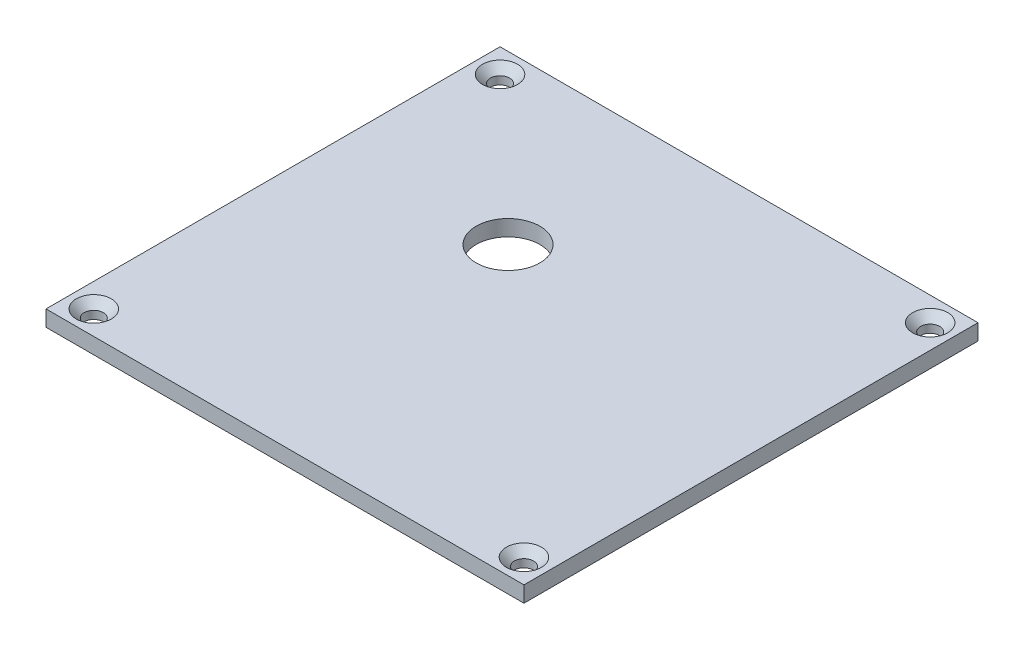
ISO-10303-21;
HEADER;
FILE_DESCRIPTION(('STEP AP214'),'2;1');
FILE_NAME('part.step','',(''),(''),'','','');
FILE_SCHEMA(('AUTOMOTIVE_DESIGN { 1 0 10303 214 1 1 1 1 }'));
ENDSEC;
DATA;
#1=APPLICATION_CONTEXT('core data for automotive mechanical design processes');
#2=APPLICATION_PROTOCOL_DEFINITION('international standard','automotive_design',2000,#1);
#3=PRODUCT_CONTEXT('',#1,'mechanical');
#4=PRODUCT('Part','Part','',(#3));
#5=PRODUCT_RELATED_PRODUCT_CATEGORY('part','',(#4));
#6=PRODUCT_DEFINITION_FORMATION('','',#4);
#7=PRODUCT_DEFINITION_CONTEXT('part definition',#1,'design');
#8=PRODUCT_DEFINITION('design','',#6,#7);
#9=PRODUCT_DEFINITION_SHAPE('','',#8);
#10=(LENGTH_UNIT() NAMED_UNIT(*) SI_UNIT(.MILLI.,.METRE.));
#11=(NAMED_UNIT(*) PLANE_ANGLE_UNIT() SI_UNIT($,.RADIAN.));
#12=(NAMED_UNIT(*) SI_UNIT($,.STERADIAN.) SOLID_ANGLE_UNIT());
#13=UNCERTAINTY_MEASURE_WITH_UNIT(LENGTH_MEASURE(1.E-05),#10,'distance_accuracy_value','');
#14=(GEOMETRIC_REPRESENTATION_CONTEXT(3) GLOBAL_UNCERTAINTY_ASSIGNED_CONTEXT((#13)) GLOBAL_UNIT_ASSIGNED_CONTEXT((#10,
#11,#12)) REPRESENTATION_CONTEXT('',''));
#15=CARTESIAN_POINT('',(0.,0.,0.));
#16=DIRECTION('',(0.,0.,1.));
#17=DIRECTION('',(1.,0.,0.));
#18=AXIS2_PLACEMENT_3D('',#15,#16,#17);
#19=CARTESIAN_POINT('',(30.,2.,28.5));
#20=DIRECTION('',(-1.,0.,0.));
#21=DIRECTION('',(0.,0.,1.));
#22=AXIS2_PLACEMENT_3D('',#19,#20,#21);
#23=PLANE('',#22);
#24=DIRECTION('',(0.,0.,-1.));
#25=VECTOR('',#24,1.);
#26=CARTESIAN_POINT('',(30.,0.,28.5));
#27=LINE('',#26,#25);
#28=CARTESIAN_POINT('',(30.,0.,28.5));
#29=VERTEX_POINT('',#28);
#30=CARTESIAN_POINT('',(30.,0.,-28.5));
#31=VERTEX_POINT('',#30);
#32=EDGE_CURVE('E99',#29,#31,#27,.T.);
#33=ORIENTED_EDGE('',*,*,#32,.T.);
#34=DIRECTION('',(0.,-1.,0.));
#35=VECTOR('',#34,1.);
#36=CARTESIAN_POINT('',(30.,2.,-28.5));
#37=LINE('',#36,#35);
#38=CARTESIAN_POINT('',(30.,2.,-28.5));
#39=VERTEX_POINT('',#38);
#40=EDGE_CURVE('E11',#39,#31,#37,.T.);
#41=ORIENTED_EDGE('',*,*,#40,.F.);
#42=DIRECTION('',(0.,0.,-1.));
#43=VECTOR('',#42,1.);
#44=CARTESIAN_POINT('',(30.,2.,28.5));
#45=LINE('',#44,#43);
#46=CARTESIAN_POINT('',(30.,2.,28.5));
#47=VERTEX_POINT('',#46);
#48=EDGE_CURVE('E87',#47,#39,#45,.T.);
#49=ORIENTED_EDGE('',*,*,#48,.F.);
#50=DIRECTION('',(0.,-1.,0.));
#51=VECTOR('',#50,1.);
#52=CARTESIAN_POINT('',(30.,2.,28.5));
#53=LINE('',#52,#51);
#54=EDGE_CURVE('E95',#47,#29,#53,.T.);
#55=ORIENTED_EDGE('',*,*,#54,.T.);
#56=EDGE_LOOP('',(#33,#41,#49,#55));
#57=FACE_BOUND('',#56,.T.);
#58=ADVANCED_FACE('F36',(#57),#23,.F.);
#59=CARTESIAN_POINT('',(-30.,2.,-28.5));
#60=DIRECTION('',(0.,0.,1.));
#61=DIRECTION('',(1.,0.,0.));
#62=AXIS2_PLACEMENT_3D('',#59,#60,#61);
#63=PLANE('',#62);
#64=DIRECTION('',(-1.,0.,0.));
#65=VECTOR('',#64,1.);
#66=CARTESIAN_POINT('',(-30.,0.,-28.5));
#67=LINE('',#66,#65);
#68=CARTESIAN_POINT('',(-30.,0.,-28.5));
#69=VERTEX_POINT('',#68);
#70=EDGE_CURVE('E91',#31,#69,#67,.T.);
#71=ORIENTED_EDGE('',*,*,#70,.T.);
#72=DIRECTION('',(0.,-1.,0.));
#73=VECTOR('',#72,1.);
#74=CARTESIAN_POINT('',(-30.,2.,-28.5));
#75=LINE('',#74,#73);
#76=CARTESIAN_POINT('',(-30.,2.,-28.5));
#77=VERTEX_POINT('',#76);
#78=EDGE_CURVE('E44',#77,#69,#75,.T.);
#79=ORIENTED_EDGE('',*,*,#78,.F.);
#80=DIRECTION('',(-1.,0.,0.));
#81=VECTOR('',#80,1.);
#82=CARTESIAN_POINT('',(-30.,2.,-28.5));
#83=LINE('',#82,#81);
#84=EDGE_CURVE('E82',#39,#77,#83,.T.);
#85=ORIENTED_EDGE('',*,*,#84,.F.);
#86=ORIENTED_EDGE('',*,*,#40,.T.);
#87=EDGE_LOOP('',(#71,#79,#85,#86));
#88=FACE_BOUND('',#87,.T.);
#89=ADVANCED_FACE('F90',(#88),#63,.F.);
#90=CARTESIAN_POINT('',(-30.,2.,28.5));
#91=DIRECTION('',(1.,0.,0.));
#92=DIRECTION('',(0.,0.,-1.));
#93=AXIS2_PLACEMENT_3D('',#90,#91,#92);
#94=PLANE('',#93);
#95=DIRECTION('',(0.,0.,1.));
#96=VECTOR('',#95,1.);
#97=CARTESIAN_POINT('',(-30.,0.,28.5));
#98=LINE('',#97,#96);
#99=CARTESIAN_POINT('',(-30.,0.,28.5));
#100=VERTEX_POINT('',#99);
#101=EDGE_CURVE('E69',#69,#100,#98,.T.);
#102=ORIENTED_EDGE('',*,*,#101,.T.);
#103=DIRECTION('',(0.,-1.,0.));
#104=VECTOR('',#103,1.);
#105=CARTESIAN_POINT('',(-30.,2.,28.5));
#106=LINE('',#105,#104);
#107=CARTESIAN_POINT('',(-30.,2.,28.5));
#108=VERTEX_POINT('',#107);
#109=EDGE_CURVE('E92',#108,#100,#106,.T.);
#110=ORIENTED_EDGE('',*,*,#109,.F.);
#111=DIRECTION('',(0.,0.,1.));
#112=VECTOR('',#111,1.);
#113=CARTESIAN_POINT('',(-30.,2.,28.5));
#114=LINE('',#113,#112);
#115=EDGE_CURVE('E85',#77,#108,#114,.T.);
#116=ORIENTED_EDGE('',*,*,#115,.F.);
#117=ORIENTED_EDGE('',*,*,#78,.T.);
#118=EDGE_LOOP('',(#102,#110,#116,#117));
#119=FACE_BOUND('',#118,.T.);
#120=ADVANCED_FACE('F93',(#119),#94,.F.);
#121=CARTESIAN_POINT('',(-30.,2.,28.5));
#122=DIRECTION('',(0.,0.,-1.));
#123=DIRECTION('',(-1.,0.,0.));
#124=AXIS2_PLACEMENT_3D('',#121,#122,#123);
#125=PLANE('',#124);
#126=DIRECTION('',(1.,0.,0.));
#127=VECTOR('',#126,1.);
#128=CARTESIAN_POINT('',(-30.,0.,28.5));
#129=LINE('',#128,#127);
#130=EDGE_CURVE('E75',#100,#29,#129,.T.);
#131=ORIENTED_EDGE('',*,*,#130,.T.);
#132=ORIENTED_EDGE('',*,*,#54,.F.);
#133=DIRECTION('',(1.,0.,0.));
#134=VECTOR('',#133,1.);
#135=CARTESIAN_POINT('',(-30.,2.,28.5));
#136=LINE('',#135,#134);
#137=EDGE_CURVE('E52',#108,#47,#136,.T.);
#138=ORIENTED_EDGE('',*,*,#137,.F.);
#139=ORIENTED_EDGE('',*,*,#109,.T.);
#140=EDGE_LOOP('',(#131,#132,#138,#139));
#141=FACE_BOUND('',#140,.T.);
#142=ADVANCED_FACE('F107',(#141),#125,.F.);
#143=CARTESIAN_POINT('',(0.,2.,0.));
#144=DIRECTION('',(0.,-1.,0.));
#145=DIRECTION('',(0.,0.,-1.));
#146=AXIS2_PLACEMENT_3D('',#143,#144,#145);
#147=PLANE('',#146);
#148=CARTESIAN_POINT('',(-8.,2.,-7.5));
#149=DIRECTION('',(0.,1.,0.));
#150=DIRECTION('',(0.,0.,1.));
#151=AXIS2_PLACEMENT_3D('',#148,#149,#150);
#152=CIRCLE('',#151,4.);
#153=CARTESIAN_POINT('',(-8.,2.,-3.5));
#154=VERTEX_POINT('',#153);
#155=EDGE_CURVE('E149',#154,#154,#152,.T.);
#156=ORIENTED_EDGE('',*,*,#155,.F.);
#157=EDGE_LOOP('',(#156));
#158=FACE_BOUND('',#157,.T.);
#159=CARTESIAN_POINT('',(-27.,2.,-25.5));
#160=DIRECTION('',(0.,1.,0.));
#161=DIRECTION('',(0.,0.,1.));
#162=AXIS2_PLACEMENT_3D('',#159,#160,#161);
#163=CIRCLE('',#162,2.2);
#164=CARTESIAN_POINT('',(-27.,2.,-23.3));
#165=VERTEX_POINT('',#164);
#166=EDGE_CURVE('E145',#165,#165,#163,.T.);
#167=ORIENTED_EDGE('',*,*,#166,.F.);
#168=EDGE_LOOP('',(#167));
#169=FACE_BOUND('',#168,.T.);
#170=CARTESIAN_POINT('',(27.,2.,-25.5));
#171=DIRECTION('',(0.,1.,0.));
#172=DIRECTION('',(0.,0.,1.));
#173=AXIS2_PLACEMENT_3D('',#170,#171,#172);
#174=CIRCLE('',#173,2.2);
#175=CARTESIAN_POINT('',(27.,2.,-23.3));
#176=VERTEX_POINT('',#175);
#177=EDGE_CURVE('E136',#176,#176,#174,.T.);
#178=ORIENTED_EDGE('',*,*,#177,.F.);
#179=EDGE_LOOP('',(#178));
#180=FACE_BOUND('',#179,.T.);
#181=CARTESIAN_POINT('',(27.,2.,25.5));
#182=DIRECTION('',(0.,1.,0.));
#183=DIRECTION('',(0.,0.,1.));
#184=AXIS2_PLACEMENT_3D('',#181,#182,#183);
#185=CIRCLE('',#184,2.2);
#186=CARTESIAN_POINT('',(27.,2.,27.7));
#187=VERTEX_POINT('',#186);
#188=EDGE_CURVE('E127',#187,#187,#185,.T.);
#189=ORIENTED_EDGE('',*,*,#188,.F.);
#190=EDGE_LOOP('',(#189));
#191=FACE_BOUND('',#190,.T.);
#192=CARTESIAN_POINT('',(-27.,2.,25.5));
#193=DIRECTION('',(0.,1.,0.));
#194=DIRECTION('',(0.,0.,1.));
#195=AXIS2_PLACEMENT_3D('',#192,#193,#194);
#196=CIRCLE('',#195,2.2);
#197=CARTESIAN_POINT('',(-27.,2.,27.7));
#198=VERTEX_POINT('',#197);
#199=EDGE_CURVE('E118',#198,#198,#196,.T.);
#200=ORIENTED_EDGE('',*,*,#199,.F.);
#201=EDGE_LOOP('',(#200));
#202=FACE_BOUND('',#201,.T.);
#203=ORIENTED_EDGE('',*,*,#48,.T.);
#204=ORIENTED_EDGE('',*,*,#84,.T.);
#205=ORIENTED_EDGE('',*,*,#115,.T.);
#206=ORIENTED_EDGE('',*,*,#137,.T.);
#207=EDGE_LOOP('',(#203,#204,#205,#206));
#208=FACE_BOUND('',#207,.T.);
#209=ADVANCED_FACE('F83',(#158,#169,#180,#191,#202,#208),#147,.F.);
#210=CARTESIAN_POINT('',(0.,0.,0.));
#211=DIRECTION('',(0.,-1.,0.));
#212=DIRECTION('',(0.,0.,-1.));
#213=AXIS2_PLACEMENT_3D('',#210,#211,#212);
#214=PLANE('',#213);
#215=CARTESIAN_POINT('',(-8.,0.,-7.5));
#216=DIRECTION('',(0.,1.,0.));
#217=DIRECTION('',(0.,0.,1.));
#218=AXIS2_PLACEMENT_3D('',#215,#216,#217);
#219=CIRCLE('',#218,4.);
#220=CARTESIAN_POINT('',(-8.,0.,-3.5));
#221=VERTEX_POINT('',#220);
#222=EDGE_CURVE('E148',#221,#221,#219,.T.);
#223=ORIENTED_EDGE('',*,*,#222,.T.);
#224=EDGE_LOOP('',(#223));
#225=FACE_BOUND('',#224,.T.);
#226=CARTESIAN_POINT('',(-27.,0.,-25.5));
#227=DIRECTION('',(0.,1.,0.));
#228=DIRECTION('',(0.,0.,1.));
#229=AXIS2_PLACEMENT_3D('',#226,#227,#228);
#230=CIRCLE('',#229,1.2);
#231=CARTESIAN_POINT('',(-27.,0.,-24.3));
#232=VERTEX_POINT('',#231);
#233=EDGE_CURVE('E139',#232,#232,#230,.T.);
#234=ORIENTED_EDGE('',*,*,#233,.T.);
#235=EDGE_LOOP('',(#234));
#236=FACE_BOUND('',#235,.T.);
#237=CARTESIAN_POINT('',(27.,0.,-25.5));
#238=DIRECTION('',(0.,1.,0.));
#239=DIRECTION('',(0.,0.,1.));
#240=AXIS2_PLACEMENT_3D('',#237,#238,#239);
#241=CIRCLE('',#240,1.2);
#242=CARTESIAN_POINT('',(27.,0.,-24.3));
#243=VERTEX_POINT('',#242);
#244=EDGE_CURVE('E130',#243,#243,#241,.T.);
#245=ORIENTED_EDGE('',*,*,#244,.T.);
#246=EDGE_LOOP('',(#245));
#247=FACE_BOUND('',#246,.T.);
#248=CARTESIAN_POINT('',(27.,0.,25.5));
#249=DIRECTION('',(0.,1.,0.));
#250=DIRECTION('',(0.,0.,1.));
#251=AXIS2_PLACEMENT_3D('',#248,#249,#250);
#252=CIRCLE('',#251,1.2);
#253=CARTESIAN_POINT('',(27.,0.,26.7));
#254=VERTEX_POINT('',#253);
#255=EDGE_CURVE('E121',#254,#254,#252,.T.);
#256=ORIENTED_EDGE('',*,*,#255,.T.);
#257=EDGE_LOOP('',(#256));
#258=FACE_BOUND('',#257,.T.);
#259=CARTESIAN_POINT('',(-27.,0.,25.5));
#260=DIRECTION('',(0.,1.,0.));
#261=DIRECTION('',(0.,0.,1.));
#262=AXIS2_PLACEMENT_3D('',#259,#260,#261);
#263=CIRCLE('',#262,1.2);
#264=CARTESIAN_POINT('',(-27.,0.,26.7));
#265=VERTEX_POINT('',#264);
#266=EDGE_CURVE('E102',#265,#265,#263,.T.);
#267=ORIENTED_EDGE('',*,*,#266,.T.);
#268=EDGE_LOOP('',(#267));
#269=FACE_BOUND('',#268,.T.);
#270=ORIENTED_EDGE('',*,*,#32,.F.);
#271=ORIENTED_EDGE('',*,*,#130,.F.);
#272=ORIENTED_EDGE('',*,*,#101,.F.);
#273=ORIENTED_EDGE('',*,*,#70,.F.);
#274=EDGE_LOOP('',(#270,#271,#272,#273));
#275=FACE_BOUND('',#274,.T.);
#276=ADVANCED_FACE('F110',(#225,#236,#247,#258,#269,#275),#214,.T.);
#277=CARTESIAN_POINT('',(-27.,2.,25.5));
#278=DIRECTION('',(0.,1.,0.));
#279=DIRECTION('',(0.,0.,1.));
#280=AXIS2_PLACEMENT_3D('',#277,#278,#279);
#281=CYLINDRICAL_SURFACE('',#280,1.2);
#282=ORIENTED_EDGE('',*,*,#266,.F.);
#283=EDGE_LOOP('',(#282));
#284=FACE_BOUND('',#283,.T.);
#285=CARTESIAN_POINT('',(-27.,0.999999999999999,25.5));
#286=DIRECTION('',(0.,1.,0.));
#287=DIRECTION('',(0.,0.,1.));
#288=AXIS2_PLACEMENT_3D('',#285,#286,#287);
#289=CIRCLE('',#288,1.2);
#290=CARTESIAN_POINT('',(-27.,0.999999999999999,26.7));
#291=VERTEX_POINT('',#290);
#292=EDGE_CURVE('E115',#291,#291,#289,.T.);
#293=ORIENTED_EDGE('',*,*,#292,.T.);
#294=EDGE_LOOP('',(#293));
#295=FACE_BOUND('',#294,.T.);
#296=ADVANCED_FACE('F178',(#284,#295),#281,.F.);
#297=CARTESIAN_POINT('',(-27.,2.,25.5));
#298=DIRECTION('',(0.,1.,0.));
#299=DIRECTION('',(0.,0.,1.));
#300=AXIS2_PLACEMENT_3D('',#297,#298,#299);
#301=CONICAL_SURFACE('',#300,2.2,0.785398163397448);
#302=ORIENTED_EDGE('',*,*,#292,.F.);
#303=EDGE_LOOP('',(#302));
#304=FACE_BOUND('',#303,.T.);
#305=ORIENTED_EDGE('',*,*,#199,.T.);
#306=EDGE_LOOP('',(#305));
#307=FACE_BOUND('',#306,.T.);
#308=ADVANCED_FACE('F175',(#304,#307),#301,.F.);
#309=CARTESIAN_POINT('',(27.,2.,25.5));
#310=DIRECTION('',(0.,1.,0.));
#311=DIRECTION('',(0.,0.,1.));
#312=AXIS2_PLACEMENT_3D('',#309,#310,#311);
#313=CYLINDRICAL_SURFACE('',#312,1.2);
#314=ORIENTED_EDGE('',*,*,#255,.F.);
#315=EDGE_LOOP('',(#314));
#316=FACE_BOUND('',#315,.T.);
#317=CARTESIAN_POINT('',(27.,0.999999999999999,25.5));
#318=DIRECTION('',(0.,1.,0.));
#319=DIRECTION('',(0.,0.,1.));
#320=AXIS2_PLACEMENT_3D('',#317,#318,#319);
#321=CIRCLE('',#320,1.2);
#322=CARTESIAN_POINT('',(27.,0.999999999999999,26.7));
#323=VERTEX_POINT('',#322);
#324=EDGE_CURVE('E124',#323,#323,#321,.T.);
#325=ORIENTED_EDGE('',*,*,#324,.T.);
#326=EDGE_LOOP('',(#325));
#327=FACE_BOUND('',#326,.T.);
#328=ADVANCED_FACE('F177',(#316,#327),#313,.F.);
#329=CARTESIAN_POINT('',(27.,2.,25.5));
#330=DIRECTION('',(0.,1.,0.));
#331=DIRECTION('',(0.,0.,1.));
#332=AXIS2_PLACEMENT_3D('',#329,#330,#331);
#333=CONICAL_SURFACE('',#332,2.2,0.785398163397448);
#334=ORIENTED_EDGE('',*,*,#324,.F.);
#335=EDGE_LOOP('',(#334));
#336=FACE_BOUND('',#335,.T.);
#337=ORIENTED_EDGE('',*,*,#188,.T.);
#338=EDGE_LOOP('',(#337));
#339=FACE_BOUND('',#338,.T.);
#340=ADVANCED_FACE('F185',(#336,#339),#333,.F.);
#341=CARTESIAN_POINT('',(27.,2.,-25.5));
#342=DIRECTION('',(0.,1.,0.));
#343=DIRECTION('',(0.,0.,1.));
#344=AXIS2_PLACEMENT_3D('',#341,#342,#343);
#345=CYLINDRICAL_SURFACE('',#344,1.2);
#346=ORIENTED_EDGE('',*,*,#244,.F.);
#347=EDGE_LOOP('',(#346));
#348=FACE_BOUND('',#347,.T.);
#349=CARTESIAN_POINT('',(27.,0.999999999999999,-25.5));
#350=DIRECTION('',(0.,1.,0.));
#351=DIRECTION('',(0.,0.,1.));
#352=AXIS2_PLACEMENT_3D('',#349,#350,#351);
#353=CIRCLE('',#352,1.2);
#354=CARTESIAN_POINT('',(27.,0.999999999999999,-24.3));
#355=VERTEX_POINT('',#354);
#356=EDGE_CURVE('E133',#355,#355,#353,.T.);
#357=ORIENTED_EDGE('',*,*,#356,.T.);
#358=EDGE_LOOP('',(#357));
#359=FACE_BOUND('',#358,.T.);
#360=ADVANCED_FACE('F238',(#348,#359),#345,.F.);
#361=CARTESIAN_POINT('',(27.,2.,-25.5));
#362=DIRECTION('',(0.,1.,0.));
#363=DIRECTION('',(0.,0.,1.));
#364=AXIS2_PLACEMENT_3D('',#361,#362,#363);
#365=CONICAL_SURFACE('',#364,2.2,0.785398163397448);
#366=ORIENTED_EDGE('',*,*,#356,.F.);
#367=EDGE_LOOP('',(#366));
#368=FACE_BOUND('',#367,.T.);
#369=ORIENTED_EDGE('',*,*,#177,.T.);
#370=EDGE_LOOP('',(#369));
#371=FACE_BOUND('',#370,.T.);
#372=ADVANCED_FACE('F249',(#368,#371),#365,.F.);
#373=CARTESIAN_POINT('',(-27.,2.,-25.5));
#374=DIRECTION('',(0.,1.,0.));
#375=DIRECTION('',(0.,0.,1.));
#376=AXIS2_PLACEMENT_3D('',#373,#374,#375);
#377=CYLINDRICAL_SURFACE('',#376,1.2);
#378=ORIENTED_EDGE('',*,*,#233,.F.);
#379=EDGE_LOOP('',(#378));
#380=FACE_BOUND('',#379,.T.);
#381=CARTESIAN_POINT('',(-27.,0.999999999999999,-25.5));
#382=DIRECTION('',(0.,1.,0.));
#383=DIRECTION('',(0.,0.,1.));
#384=AXIS2_PLACEMENT_3D('',#381,#382,#383);
#385=CIRCLE('',#384,1.2);
#386=CARTESIAN_POINT('',(-27.,0.999999999999999,-24.3));
#387=VERTEX_POINT('',#386);
#388=EDGE_CURVE('E142',#387,#387,#385,.T.);
#389=ORIENTED_EDGE('',*,*,#388,.T.);
#390=EDGE_LOOP('',(#389));
#391=FACE_BOUND('',#390,.T.);
#392=ADVANCED_FACE('F260',(#380,#391),#377,.F.);
#393=CARTESIAN_POINT('',(-27.,2.,-25.5));
#394=DIRECTION('',(0.,1.,0.));
#395=DIRECTION('',(0.,0.,1.));
#396=AXIS2_PLACEMENT_3D('',#393,#394,#395);
#397=CONICAL_SURFACE('',#396,2.2,0.785398163397448);
#398=ORIENTED_EDGE('',*,*,#388,.F.);
#399=EDGE_LOOP('',(#398));
#400=FACE_BOUND('',#399,.T.);
#401=ORIENTED_EDGE('',*,*,#166,.T.);
#402=EDGE_LOOP('',(#401));
#403=FACE_BOUND('',#402,.T.);
#404=ADVANCED_FACE('F160',(#400,#403),#397,.F.);
#405=CARTESIAN_POINT('',(-8.,0.,-7.5));
#406=DIRECTION('',(0.,1.,0.));
#407=DIRECTION('',(0.,0.,1.));
#408=AXIS2_PLACEMENT_3D('',#405,#406,#407);
#409=CYLINDRICAL_SURFACE('',#408,4.);
#410=ORIENTED_EDGE('',*,*,#222,.F.);
#411=EDGE_LOOP('',(#410));
#412=FACE_BOUND('',#411,.T.);
#413=ORIENTED_EDGE('',*,*,#155,.T.);
#414=EDGE_LOOP('',(#413));
#415=FACE_BOUND('',#414,.T.);
#416=ADVANCED_FACE('F157',(#412,#415),#409,.F.);
#417=CLOSED_SHELL('',(#58,#89,#120,#142,#209,#276,#296,#308,#328,#340,#360,#372,#392,#404,#416));
#418=MANIFOLD_SOLID_BREP('B2',#417);
#419=ADVANCED_BREP_SHAPE_REPRESENTATION('',(#18,#418),#14);
#420=SHAPE_DEFINITION_REPRESENTATION(#9,#419);
ENDSEC;
END-ISO-10303-21;
